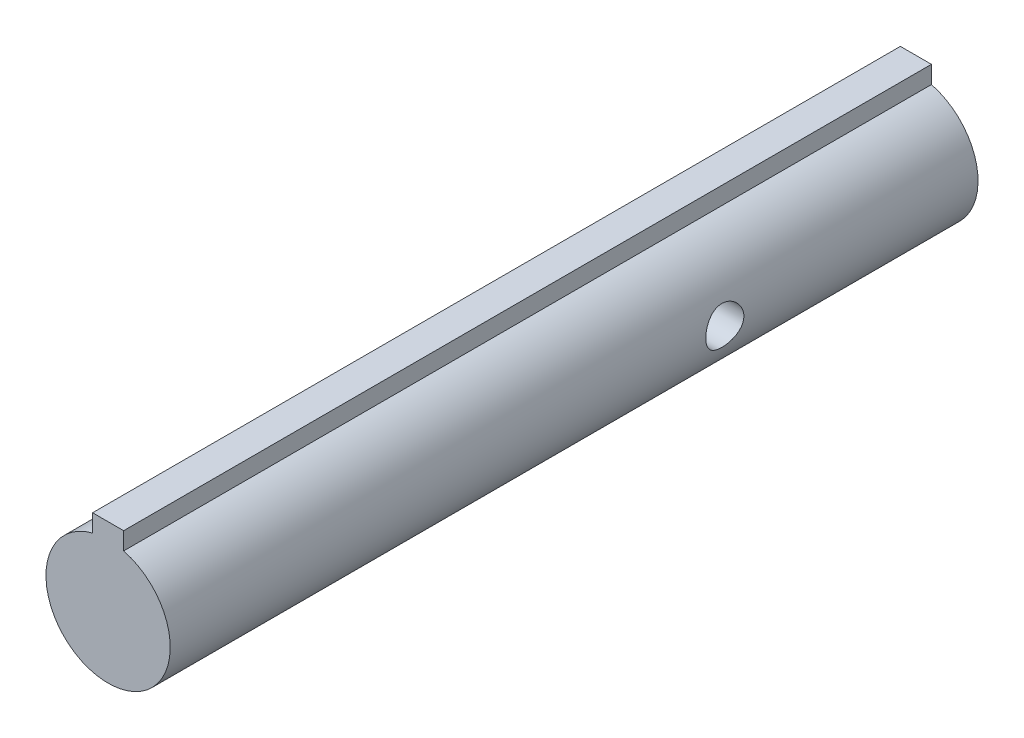
ISO-10303-21;
HEADER;
FILE_DESCRIPTION(('STEP AP214'),'2;1');
FILE_NAME('part.step','',(''),(''),'','','');
FILE_SCHEMA(('AUTOMOTIVE_DESIGN { 1 0 10303 214 1 1 1 1 }'));
ENDSEC;
DATA;
#1=APPLICATION_CONTEXT('core data for automotive mechanical design processes');
#2=APPLICATION_PROTOCOL_DEFINITION('international standard','automotive_design',2000,#1);
#3=PRODUCT_CONTEXT('',#1,'mechanical');
#4=PRODUCT('Part','Part','',(#3));
#5=PRODUCT_RELATED_PRODUCT_CATEGORY('part','',(#4));
#6=PRODUCT_DEFINITION_FORMATION('','',#4);
#7=PRODUCT_DEFINITION_CONTEXT('part definition',#1,'design');
#8=PRODUCT_DEFINITION('design','',#6,#7);
#9=PRODUCT_DEFINITION_SHAPE('','',#8);
#10=(LENGTH_UNIT() NAMED_UNIT(*) SI_UNIT(.MILLI.,.METRE.));
#11=(NAMED_UNIT(*) PLANE_ANGLE_UNIT() SI_UNIT($,.RADIAN.));
#12=(NAMED_UNIT(*) SI_UNIT($,.STERADIAN.) SOLID_ANGLE_UNIT());
#13=UNCERTAINTY_MEASURE_WITH_UNIT(LENGTH_MEASURE(1.E-05),#10,'distance_accuracy_value','');
#14=(GEOMETRIC_REPRESENTATION_CONTEXT(3) GLOBAL_UNCERTAINTY_ASSIGNED_CONTEXT((#13)) GLOBAL_UNIT_ASSIGNED_CONTEXT((#10,
#11,#12)) REPRESENTATION_CONTEXT('',''));
#15=CARTESIAN_POINT('',(0.,0.,0.));
#16=DIRECTION('',(0.,0.,1.));
#17=DIRECTION('',(1.,0.,0.));
#18=AXIS2_PLACEMENT_3D('',#15,#16,#17);
#19=CARTESIAN_POINT('',(0.,0.,52.));
#20=DIRECTION('',(0.,0.,-1.));
#21=DIRECTION('',(-1.,0.,0.));
#22=AXIS2_PLACEMENT_3D('',#19,#20,#21);
#23=CYLINDRICAL_SURFACE('',#22,4.);
#24=CARTESIAN_POINT('',(-4.,0.,15.075));
#25=CARTESIAN_POINT('',(-3.99999953789414,0.0671369722633264,15.0750006323655));
#26=CARTESIAN_POINT('',(-3.99829367753904,0.134280380916146,15.0805374762973));
#27=CARTESIAN_POINT('',(-3.9916555500739,0.266607811918652,15.1024832813154));
#28=CARTESIAN_POINT('',(-3.98672243606523,0.331791315250643,15.1188950962352));
#29=CARTESIAN_POINT('',(-3.97416952957556,0.458271410064262,15.1619884993725));
#30=CARTESIAN_POINT('',(-3.96655379927208,0.519573714023701,15.1886545655583));
#31=CARTESIAN_POINT('',(-3.94942462784201,0.636836915120836,15.2514346822455));
#32=CARTESIAN_POINT('',(-3.93991091092759,0.692797034260681,15.2875501060281));
#33=CARTESIAN_POINT('',(-3.91968114553553,0.799454598581506,15.3693368694037));
#34=CARTESIAN_POINT('',(-3.90893968109693,0.849970493560227,15.4152386609227));
#35=CARTESIAN_POINT('',(-3.88761447257959,0.94272115049378,15.5148042528797));
#36=CARTESIAN_POINT('',(-3.8770307567226,0.984954446712253,15.5684694242555));
#37=CARTESIAN_POINT('',(-3.85694858866008,1.06091078421262,15.6835921661835));
#38=CARTESIAN_POINT('',(-3.84748161434551,1.09440965368309,15.7452036516078));
#39=CARTESIAN_POINT('',(-3.83108587028549,1.150495998814,15.8735223739247));
#40=CARTESIAN_POINT('',(-3.8241564619976,1.17308621993739,15.9402283237547));
#41=CARTESIAN_POINT('',(-3.81388577398779,1.20605456708385,16.0747987632127));
#42=CARTESIAN_POINT('',(-3.81044609512752,1.21676843072414,16.1425732853743));
#43=CARTESIAN_POINT('',(-3.80725187617706,1.22672857494494,16.2790384174789));
#44=CARTESIAN_POINT('',(-3.80749640055767,1.22597776674723,16.3477287904339));
#45=CARTESIAN_POINT('',(-3.81155592552413,1.21329303408136,16.4813223904365));
#46=CARTESIAN_POINT('',(-3.81523565583335,1.20178276918105,16.5462706409238));
#47=CARTESIAN_POINT('',(-3.82553168894293,1.16859154569072,16.673265966277));
#48=CARTESIAN_POINT('',(-3.83214829257016,1.14690954518669,16.7353127432222));
#49=CARTESIAN_POINT('',(-3.84767837246314,1.09368466740552,16.855766699653));
#50=CARTESIAN_POINT('',(-3.85662303397052,1.06200655923914,16.9141099319208));
#51=CARTESIAN_POINT('',(-3.87578674998554,0.989782643380883,17.0247930030073));
#52=CARTESIAN_POINT('',(-3.88600612414613,0.949234609495627,17.0771313296654));
#53=CARTESIAN_POINT('',(-3.90711346341057,0.858330232868484,17.1767179756988));
#54=CARTESIAN_POINT('',(-3.91801114837691,0.807623213129641,17.2236447007797));
#55=CARTESIAN_POINT('',(-3.93885313951151,0.698923686707802,17.3084051015301));
#56=CARTESIAN_POINT('',(-3.94879738049672,0.640930682537198,17.3462381557689));
#57=CARTESIAN_POINT('',(-3.96670947629008,0.518703450436546,17.4119436949118));
#58=CARTESIAN_POINT('',(-3.97466252111691,0.454427127640747,17.439742182821));
#59=CARTESIAN_POINT('',(-3.98758932617751,0.321810932292837,17.4840380297391));
#60=CARTESIAN_POINT('',(-3.99256395375359,0.253472249115937,17.500538678983));
#61=CARTESIAN_POINT('',(-3.99883505239623,0.117403094659349,17.5212289061623));
#62=CARTESIAN_POINT('',(-4.00026160700224,0.0497447575509373,17.5258540914446));
#63=CARTESIAN_POINT('',(-3.9996589941398,-0.0853870913437197,17.523886634514));
#64=CARTESIAN_POINT('',(-3.99763030941729,-0.152860627630088,17.5172955593718));
#65=CARTESIAN_POINT('',(-3.99043048391886,-0.284045549760898,17.4934336765462));
#66=CARTESIAN_POINT('',(-3.98533496911786,-0.347808201148525,17.4764197155376));
#67=CARTESIAN_POINT('',(-3.97259434475592,-0.471558039797332,17.4325062173559));
#68=CARTESIAN_POINT('',(-3.96494892432206,-0.531544765654283,17.4056054747905));
#69=CARTESIAN_POINT('',(-3.94767148351382,-0.64762457160098,17.3419657385371));
#70=CARTESIAN_POINT('',(-3.93799657028394,-0.703591243290744,17.3050081356288));
#71=CARTESIAN_POINT('',(-3.91776874735334,-0.808675689849089,17.2225677316474));
#72=CARTESIAN_POINT('',(-3.90721560896478,-0.857791671847413,17.1770827061654));
#73=CARTESIAN_POINT('',(-3.8859176921675,-0.949713982731709,17.0768307227832));
#74=CARTESIAN_POINT('',(-3.87518084143485,-0.992210094354978,17.0217770063722));
#75=CARTESIAN_POINT('',(-3.85515332914494,-1.06738540277731,16.9050863581957));
#76=CARTESIAN_POINT('',(-3.84586263662684,-1.1000648097563,16.8434495674149));
#77=CARTESIAN_POINT('',(-3.82988461731147,-1.15446486713428,16.7155061368311));
#78=CARTESIAN_POINT('',(-3.82318614353645,-1.17623256187747,16.6492209733548));
#79=CARTESIAN_POINT('',(-3.81319771006047,-1.20822579718577,16.5136807380609));
#80=CARTESIAN_POINT('',(-3.80990651911987,-1.21845550718221,16.4444267484717));
#81=CARTESIAN_POINT('',(-3.80723008182407,-1.22679093632019,16.3081473995964));
#82=CARTESIAN_POINT('',(-3.80768140135878,-1.22540392615225,16.2411558823133));
#83=CARTESIAN_POINT('',(-3.81204416404972,-1.21176293986576,16.1084091615921));
#84=CARTESIAN_POINT('',(-3.81595545754945,-1.1995094337628,16.042653904807));
#85=CARTESIAN_POINT('',(-3.82668554633072,-1.16481682866911,15.915113993052));
#86=CARTESIAN_POINT('',(-3.83346439394588,-1.14251741100125,15.8532877308334));
#87=CARTESIAN_POINT('',(-3.84915700417924,-1.08847529512719,15.7342047156033));
#88=CARTESIAN_POINT('',(-3.85807118833994,-1.0567307320296,15.6769488678288));
#89=CARTESIAN_POINT('',(-3.87745023870873,-0.983296210746536,15.5662917115081));
#90=CARTESIAN_POINT('',(-3.88796095899039,-0.941275887620114,15.5131176829658));
#91=CARTESIAN_POINT('',(-3.9091320373316,-0.849070672369355,15.4144113319558));
#92=CARTESIAN_POINT('',(-3.91979243412154,-0.798883630069103,15.3688810283987));
#93=CARTESIAN_POINT('',(-3.9404568943847,-0.689902134586477,15.2853488845075));
#94=CARTESIAN_POINT('',(-3.95043048549365,-0.630889577035135,15.2476232487927));
#95=CARTESIAN_POINT('',(-3.96822369088762,-0.50705420244838,15.1826800077694));
#96=CARTESIAN_POINT('',(-3.97604423334961,-0.442233905147668,15.1554578723746));
#97=CARTESIAN_POINT('',(-3.98803532608516,-0.315049168102826,15.1145062227773));
#98=CARTESIAN_POINT('',(-3.99248407622113,-0.253045767776807,15.0997327780897));
#99=CARTESIAN_POINT('',(-3.9984663641789,-0.127363301798091,15.0799802677676));
#100=CARTESIAN_POINT('',(-4.00000043834271,-0.0636845466215488,15.0749994001531));
#101=CARTESIAN_POINT('',(-4.,0.,15.075));
#102=B_SPLINE_CURVE_WITH_KNOTS('',3,(#24,#25,#26,#27,#28,#29,#30,#31,#32,#33,#34,#35,#36,#37,
#38,#39,#40,#41,#42,#43,#44,#45,#46,#47,#48,#49,#50,#51,#52,#53,#54,#55,#56,#57,#58,#59,#60,#61,
#62,#63,#64,#65,#66,#67,#68,#69,#70,#71,#72,#73,#74,#75,#76,#77,#78,#79,#80,#81,#82,#83,#84,#85,
#86,#87,#88,#89,#90,#91,#92,#93,#94,#95,#96,#97,#98,#99,#100,#101),.UNSPECIFIED.,.T.,.F.,(4,2,2,
2,2,2,2,2,2,2,2,2,2,2,2,2,2,2,2,2,2,2,2,2,2,2,2,2,2,2,2,2,2,2,2,2,2,2,4),(0.,0.201176911820869,
0.402406637844905,0.60333295054601,0.804288480231108,1.01063734442198,1.21702269240991,
1.42827495267271,1.6394740177174,1.84453697099714,2.049547853549,2.24681178730653,
2.44409593167086,2.6441725151477,2.84429937201635,3.05315542688138,3.26202575021308,
3.47240629414784,3.68272554351072,3.88521200219971,4.08767017297918,4.28532944281248,
4.4830128191809,4.68539404988832,4.88782814610577,5.09794520046376,5.30805775580332,
5.51725647645434,5.72637957562939,5.92642007355171,6.12645191941474,6.32378442683315,
6.52115592234148,6.72598248709484,6.93086306715574,7.14207648395306,7.3531987037811,
7.54406549767716,7.73489716595353),.UNSPECIFIED.);
#103=CARTESIAN_POINT('',(-4.,0.,15.075));
#104=VERTEX_POINT('',#103);
#105=EDGE_CURVE('E43',#104,#104,#102,.T.);
#106=ORIENTED_EDGE('',*,*,#105,.T.);
#107=EDGE_LOOP('',(#106));
#108=FACE_BOUND('',#107,.T.);
#109=CARTESIAN_POINT('',(4.,0.,15.075));
#110=CARTESIAN_POINT('',(3.99999953789414,-0.0671369722633264,15.0750006323655));
#111=CARTESIAN_POINT('',(3.99829367753904,-0.134280380916146,15.0805374762973));
#112=CARTESIAN_POINT('',(3.9916555500739,-0.266607811918652,15.1024832813154));
#113=CARTESIAN_POINT('',(3.98672243606523,-0.331791315250643,15.1188950962352));
#114=CARTESIAN_POINT('',(3.97416952957556,-0.458271410064262,15.1619884993725));
#115=CARTESIAN_POINT('',(3.96655379927208,-0.519573714023701,15.1886545655583));
#116=CARTESIAN_POINT('',(3.94942462784201,-0.636836915120836,15.2514346822455));
#117=CARTESIAN_POINT('',(3.93991091092759,-0.692797034260681,15.2875501060281));
#118=CARTESIAN_POINT('',(3.91968114553553,-0.799454598581506,15.3693368694037));
#119=CARTESIAN_POINT('',(3.90893968109693,-0.849970493560227,15.4152386609227));
#120=CARTESIAN_POINT('',(3.88761447257959,-0.94272115049378,15.5148042528797));
#121=CARTESIAN_POINT('',(3.8770307567226,-0.984954446712253,15.5684694242555));
#122=CARTESIAN_POINT('',(3.85694858866008,-1.06091078421262,15.6835921661835));
#123=CARTESIAN_POINT('',(3.84748161434551,-1.09440965368309,15.7452036516078));
#124=CARTESIAN_POINT('',(3.83108587028549,-1.150495998814,15.8735223739247));
#125=CARTESIAN_POINT('',(3.8241564619976,-1.17308621993739,15.9402283237547));
#126=CARTESIAN_POINT('',(3.81388577398779,-1.20605456708385,16.0747987632127));
#127=CARTESIAN_POINT('',(3.81044609512752,-1.21676843072414,16.1425732853743));
#128=CARTESIAN_POINT('',(3.80725187617706,-1.22672857494494,16.2790384174789));
#129=CARTESIAN_POINT('',(3.80749640055767,-1.22597776674723,16.3477287904339));
#130=CARTESIAN_POINT('',(3.81155592552413,-1.21329303408136,16.4813223904365));
#131=CARTESIAN_POINT('',(3.81523565583335,-1.20178276918105,16.5462706409238));
#132=CARTESIAN_POINT('',(3.82553168894293,-1.16859154569072,16.673265966277));
#133=CARTESIAN_POINT('',(3.83214829257016,-1.14690954518669,16.7353127432222));
#134=CARTESIAN_POINT('',(3.84767837246314,-1.09368466740552,16.855766699653));
#135=CARTESIAN_POINT('',(3.85662303397052,-1.06200655923914,16.9141099319208));
#136=CARTESIAN_POINT('',(3.87578674998554,-0.989782643380883,17.0247930030073));
#137=CARTESIAN_POINT('',(3.88600612414613,-0.949234609495627,17.0771313296654));
#138=CARTESIAN_POINT('',(3.90711346341057,-0.858330232868484,17.1767179756988));
#139=CARTESIAN_POINT('',(3.91801114837691,-0.807623213129641,17.2236447007797));
#140=CARTESIAN_POINT('',(3.93885313951151,-0.698923686707802,17.3084051015301));
#141=CARTESIAN_POINT('',(3.94879738049672,-0.640930682537198,17.3462381557689));
#142=CARTESIAN_POINT('',(3.96670947629008,-0.518703450436546,17.4119436949118));
#143=CARTESIAN_POINT('',(3.97466252111691,-0.454427127640747,17.439742182821));
#144=CARTESIAN_POINT('',(3.98758932617751,-0.321810932292837,17.4840380297391));
#145=CARTESIAN_POINT('',(3.99256395375359,-0.253472249115937,17.500538678983));
#146=CARTESIAN_POINT('',(3.99883505239623,-0.117403094659349,17.5212289061623));
#147=CARTESIAN_POINT('',(4.00026160700224,-0.0497447575509373,17.5258540914446));
#148=CARTESIAN_POINT('',(3.9996589941398,0.0853870913437197,17.523886634514));
#149=CARTESIAN_POINT('',(3.99763030941729,0.152860627630088,17.5172955593718));
#150=CARTESIAN_POINT('',(3.99043048391886,0.284045549760898,17.4934336765462));
#151=CARTESIAN_POINT('',(3.98533496911786,0.347808201148525,17.4764197155376));
#152=CARTESIAN_POINT('',(3.97259434475592,0.471558039797332,17.4325062173559));
#153=CARTESIAN_POINT('',(3.96494892432206,0.531544765654283,17.4056054747905));
#154=CARTESIAN_POINT('',(3.94767148351382,0.64762457160098,17.3419657385371));
#155=CARTESIAN_POINT('',(3.93799657028394,0.703591243290744,17.3050081356288));
#156=CARTESIAN_POINT('',(3.91776874735334,0.808675689849089,17.2225677316474));
#157=CARTESIAN_POINT('',(3.90721560896478,0.857791671847413,17.1770827061654));
#158=CARTESIAN_POINT('',(3.8859176921675,0.949713982731709,17.0768307227832));
#159=CARTESIAN_POINT('',(3.87518084143485,0.992210094354978,17.0217770063722));
#160=CARTESIAN_POINT('',(3.85515332914494,1.06738540277731,16.9050863581957));
#161=CARTESIAN_POINT('',(3.84586263662684,1.1000648097563,16.8434495674149));
#162=CARTESIAN_POINT('',(3.82988461731147,1.15446486713428,16.7155061368311));
#163=CARTESIAN_POINT('',(3.82318614353645,1.17623256187747,16.6492209733548));
#164=CARTESIAN_POINT('',(3.81319771006047,1.20822579718577,16.5136807380609));
#165=CARTESIAN_POINT('',(3.80990651911987,1.21845550718221,16.4444267484717));
#166=CARTESIAN_POINT('',(3.80723008182407,1.22679093632019,16.3081473995964));
#167=CARTESIAN_POINT('',(3.80768140135878,1.22540392615225,16.2411558823133));
#168=CARTESIAN_POINT('',(3.81204416404972,1.21176293986576,16.1084091615921));
#169=CARTESIAN_POINT('',(3.81595545754945,1.1995094337628,16.042653904807));
#170=CARTESIAN_POINT('',(3.82668554633072,1.16481682866911,15.915113993052));
#171=CARTESIAN_POINT('',(3.83346439394588,1.14251741100125,15.8532877308334));
#172=CARTESIAN_POINT('',(3.84915700417924,1.08847529512719,15.7342047156033));
#173=CARTESIAN_POINT('',(3.85807118833994,1.0567307320296,15.6769488678288));
#174=CARTESIAN_POINT('',(3.87745023870873,0.983296210746536,15.5662917115081));
#175=CARTESIAN_POINT('',(3.88796095899039,0.941275887620114,15.5131176829658));
#176=CARTESIAN_POINT('',(3.9091320373316,0.849070672369355,15.4144113319558));
#177=CARTESIAN_POINT('',(3.91979243412154,0.798883630069103,15.3688810283987));
#178=CARTESIAN_POINT('',(3.9404568943847,0.689902134586477,15.2853488845075));
#179=CARTESIAN_POINT('',(3.95043048549365,0.630889577035135,15.2476232487927));
#180=CARTESIAN_POINT('',(3.96822369088762,0.50705420244838,15.1826800077694));
#181=CARTESIAN_POINT('',(3.97604423334961,0.442233905147668,15.1554578723746));
#182=CARTESIAN_POINT('',(3.98803532608516,0.315049168102826,15.1145062227773));
#183=CARTESIAN_POINT('',(3.99248407622113,0.253045767776807,15.0997327780897));
#184=CARTESIAN_POINT('',(3.9984663641789,0.127363301798091,15.0799802677676));
#185=CARTESIAN_POINT('',(4.00000043834271,0.0636845466215488,15.0749994001531));
#186=CARTESIAN_POINT('',(4.,0.,15.075));
#187=B_SPLINE_CURVE_WITH_KNOTS('',3,(#109,#110,#111,#112,#113,#114,#115,#116,#117,#118,#119,
#120,#121,#122,#123,#124,#125,#126,#127,#128,#129,#130,#131,#132,#133,#134,#135,#136,#137,#138,
#139,#140,#141,#142,#143,#144,#145,#146,#147,#148,#149,#150,#151,#152,#153,#154,#155,#156,#157,
#158,#159,#160,#161,#162,#163,#164,#165,#166,#167,#168,#169,#170,#171,#172,#173,#174,#175,#176,
#177,#178,#179,#180,#181,#182,#183,#184,#185,#186),.UNSPECIFIED.,.T.,.F.,(4,2,2,2,2,2,2,2,2,2,2,
2,2,2,2,2,2,2,2,2,2,2,2,2,2,2,2,2,2,2,2,2,2,2,2,2,2,2,4),(0.,0.201176911820869,
0.402406637844905,0.60333295054601,0.804288480231108,1.01063734442198,1.21702269240991,
1.42827495267271,1.6394740177174,1.84453697099714,2.049547853549,2.24681178730653,
2.44409593167086,2.6441725151477,2.84429937201635,3.05315542688138,3.26202575021308,
3.47240629414784,3.68272554351072,3.88521200219971,4.08767017297918,4.28532944281248,
4.4830128191809,4.68539404988832,4.88782814610577,5.09794520046376,5.30805775580332,
5.51725647645434,5.72637957562939,5.92642007355171,6.12645191941474,6.32378442683315,
6.52115592234148,6.72598248709484,6.93086306715574,7.14207648395306,7.3531987037811,
7.54406549767716,7.73489716595353),.UNSPECIFIED.);
#188=CARTESIAN_POINT('',(4.,0.,15.075));
#189=VERTEX_POINT('',#188);
#190=EDGE_CURVE('E117',#189,#189,#187,.T.);
#191=ORIENTED_EDGE('',*,*,#190,.T.);
#192=EDGE_LOOP('',(#191));
#193=FACE_BOUND('',#192,.T.);
#194=CARTESIAN_POINT('',(0.,0.,0.));
#195=DIRECTION('',(0.,0.,1.));
#196=DIRECTION('',(1.,0.,0.));
#197=AXIS2_PLACEMENT_3D('',#194,#195,#196);
#198=CIRCLE('',#197,4.);
#199=CARTESIAN_POINT('',(-1.,3.87298334620742,0.));
#200=VERTEX_POINT('',#199);
#201=CARTESIAN_POINT('',(1.,3.87298334620742,0.));
#202=VERTEX_POINT('',#201);
#203=EDGE_CURVE('E110',#200,#202,#198,.T.);
#204=ORIENTED_EDGE('',*,*,#203,.T.);
#205=DIRECTION('',(0.,0.,-1.));
#206=VECTOR('',#205,1.);
#207=CARTESIAN_POINT('',(1.,3.87298334620742,52.));
#208=LINE('',#207,#206);
#209=CARTESIAN_POINT('',(1.,3.87298334620742,52.));
#210=VERTEX_POINT('',#209);
#211=EDGE_CURVE('E11',#210,#202,#208,.T.);
#212=ORIENTED_EDGE('',*,*,#211,.F.);
#213=CARTESIAN_POINT('',(0.,0.,52.));
#214=DIRECTION('',(0.,0.,1.));
#215=DIRECTION('',(1.,0.,0.));
#216=AXIS2_PLACEMENT_3D('',#213,#214,#215);
#217=CIRCLE('',#216,4.);
#218=CARTESIAN_POINT('',(-1.,3.87298334620742,52.));
#219=VERTEX_POINT('',#218);
#220=EDGE_CURVE('E97',#219,#210,#217,.T.);
#221=ORIENTED_EDGE('',*,*,#220,.F.);
#222=DIRECTION('',(0.,0.,-1.));
#223=VECTOR('',#222,1.);
#224=CARTESIAN_POINT('',(-1.,3.87298334620742,52.));
#225=LINE('',#224,#223);
#226=EDGE_CURVE('E106',#219,#200,#225,.T.);
#227=ORIENTED_EDGE('',*,*,#226,.T.);
#228=EDGE_LOOP('',(#204,#212,#221,#227));
#229=FACE_BOUND('',#228,.T.);
#230=ADVANCED_FACE('F39',(#108,#193,#229),#23,.T.);
#231=CARTESIAN_POINT('',(1.,5.00298334620742,52.));
#232=DIRECTION('',(-1.,0.,0.));
#233=DIRECTION('',(0.,-1.,0.));
#234=AXIS2_PLACEMENT_3D('',#231,#232,#233);
#235=PLANE('',#234);
#236=DIRECTION('',(0.,1.,0.));
#237=VECTOR('',#236,1.);
#238=CARTESIAN_POINT('',(1.,5.00298334620742,0.));
#239=LINE('',#238,#237);
#240=CARTESIAN_POINT('',(1.,5.00298334620742,0.));
#241=VERTEX_POINT('',#240);
#242=EDGE_CURVE('E101',#202,#241,#239,.T.);
#243=ORIENTED_EDGE('',*,*,#242,.T.);
#244=DIRECTION('',(0.,0.,-1.));
#245=VECTOR('',#244,1.);
#246=CARTESIAN_POINT('',(1.,5.00298334620742,52.));
#247=LINE('',#246,#245);
#248=CARTESIAN_POINT('',(1.,5.00298334620742,52.));
#249=VERTEX_POINT('',#248);
#250=EDGE_CURVE('E53',#249,#241,#247,.T.);
#251=ORIENTED_EDGE('',*,*,#250,.F.);
#252=DIRECTION('',(0.,1.,0.));
#253=VECTOR('',#252,1.);
#254=CARTESIAN_POINT('',(1.,5.00298334620742,52.));
#255=LINE('',#254,#253);
#256=EDGE_CURVE('E92',#210,#249,#255,.T.);
#257=ORIENTED_EDGE('',*,*,#256,.F.);
#258=ORIENTED_EDGE('',*,*,#211,.T.);
#259=EDGE_LOOP('',(#243,#251,#257,#258));
#260=FACE_BOUND('',#259,.T.);
#261=ADVANCED_FACE('F100',(#260),#235,.F.);
#262=CARTESIAN_POINT('',(-1.,5.00298334620742,52.));
#263=DIRECTION('',(0.,-1.,0.));
#264=DIRECTION('',(0.,0.,-1.));
#265=AXIS2_PLACEMENT_3D('',#262,#263,#264);
#266=PLANE('',#265);
#267=DIRECTION('',(-1.,0.,0.));
#268=VECTOR('',#267,1.);
#269=CARTESIAN_POINT('',(-1.,5.00298334620742,0.));
#270=LINE('',#269,#268);
#271=CARTESIAN_POINT('',(-1.,5.00298334620742,0.));
#272=VERTEX_POINT('',#271);
#273=EDGE_CURVE('E79',#241,#272,#270,.T.);
#274=ORIENTED_EDGE('',*,*,#273,.T.);
#275=DIRECTION('',(0.,0.,-1.));
#276=VECTOR('',#275,1.);
#277=CARTESIAN_POINT('',(-1.,5.00298334620742,52.));
#278=LINE('',#277,#276);
#279=CARTESIAN_POINT('',(-1.,5.00298334620742,52.));
#280=VERTEX_POINT('',#279);
#281=EDGE_CURVE('E102',#280,#272,#278,.T.);
#282=ORIENTED_EDGE('',*,*,#281,.F.);
#283=DIRECTION('',(-1.,0.,0.));
#284=VECTOR('',#283,1.);
#285=CARTESIAN_POINT('',(-1.,5.00298334620742,52.));
#286=LINE('',#285,#284);
#287=EDGE_CURVE('E95',#249,#280,#286,.T.);
#288=ORIENTED_EDGE('',*,*,#287,.F.);
#289=ORIENTED_EDGE('',*,*,#250,.T.);
#290=EDGE_LOOP('',(#274,#282,#288,#289));
#291=FACE_BOUND('',#290,.T.);
#292=ADVANCED_FACE('F104',(#291),#266,.F.);
#293=CARTESIAN_POINT('',(-1.,3.87298334620742,52.));
#294=DIRECTION('',(1.,0.,0.));
#295=DIRECTION('',(0.,0.,-1.));
#296=AXIS2_PLACEMENT_3D('',#293,#294,#295);
#297=PLANE('',#296);
#298=DIRECTION('',(0.,-1.,0.));
#299=VECTOR('',#298,1.);
#300=CARTESIAN_POINT('',(-1.,3.87298334620742,0.));
#301=LINE('',#300,#299);
#302=EDGE_CURVE('E85',#272,#200,#301,.T.);
#303=ORIENTED_EDGE('',*,*,#302,.T.);
#304=ORIENTED_EDGE('',*,*,#226,.F.);
#305=DIRECTION('',(0.,-1.,0.));
#306=VECTOR('',#305,1.);
#307=CARTESIAN_POINT('',(-1.,3.87298334620742,52.));
#308=LINE('',#307,#306);
#309=EDGE_CURVE('E62',#280,#219,#308,.T.);
#310=ORIENTED_EDGE('',*,*,#309,.F.);
#311=ORIENTED_EDGE('',*,*,#281,.T.);
#312=EDGE_LOOP('',(#303,#304,#310,#311));
#313=FACE_BOUND('',#312,.T.);
#314=ADVANCED_FACE('F131',(#313),#297,.F.);
#315=CARTESIAN_POINT('',(0.,0.,52.));
#316=DIRECTION('',(0.,0.,1.));
#317=DIRECTION('',(1.,0.,0.));
#318=AXIS2_PLACEMENT_3D('',#315,#316,#317);
#319=PLANE('',#318);
#320=ORIENTED_EDGE('',*,*,#220,.T.);
#321=ORIENTED_EDGE('',*,*,#256,.T.);
#322=ORIENTED_EDGE('',*,*,#287,.T.);
#323=ORIENTED_EDGE('',*,*,#309,.T.);
#324=EDGE_LOOP('',(#320,#321,#322,#323));
#325=FACE_BOUND('',#324,.T.);
#326=ADVANCED_FACE('F93',(#325),#319,.T.);
#327=CARTESIAN_POINT('',(0.,0.,0.));
#328=DIRECTION('',(0.,0.,1.));
#329=DIRECTION('',(1.,0.,0.));
#330=AXIS2_PLACEMENT_3D('',#327,#328,#329);
#331=PLANE('',#330);
#332=ORIENTED_EDGE('',*,*,#203,.F.);
#333=ORIENTED_EDGE('',*,*,#302,.F.);
#334=ORIENTED_EDGE('',*,*,#273,.F.);
#335=ORIENTED_EDGE('',*,*,#242,.F.);
#336=EDGE_LOOP('',(#332,#333,#334,#335));
#337=FACE_BOUND('',#336,.T.);
#338=ADVANCED_FACE('F126',(#337),#331,.F.);
#339=CARTESIAN_POINT('',(-25.,0.,16.3));
#340=DIRECTION('',(1.,0.,0.));
#341=DIRECTION('',(0.,0.,-1.));
#342=AXIS2_PLACEMENT_3D('',#339,#340,#341);
#343=CYLINDRICAL_SURFACE('',#342,1.225);
#344=ORIENTED_EDGE('',*,*,#190,.F.);
#345=EDGE_LOOP('',(#344));
#346=FACE_BOUND('',#345,.T.);
#347=ORIENTED_EDGE('',*,*,#105,.F.);
#348=EDGE_LOOP('',(#347));
#349=FACE_BOUND('',#348,.T.);
#350=ADVANCED_FACE('F122',(#346,#349),#343,.F.);
#351=CLOSED_SHELL('',(#230,#261,#292,#314,#326,#338,#350));
#352=MANIFOLD_SOLID_BREP('B2',#351);
#353=ADVANCED_BREP_SHAPE_REPRESENTATION('',(#18,#352),#14);
#354=SHAPE_DEFINITION_REPRESENTATION(#9,#353);
ENDSEC;
END-ISO-10303-21;
